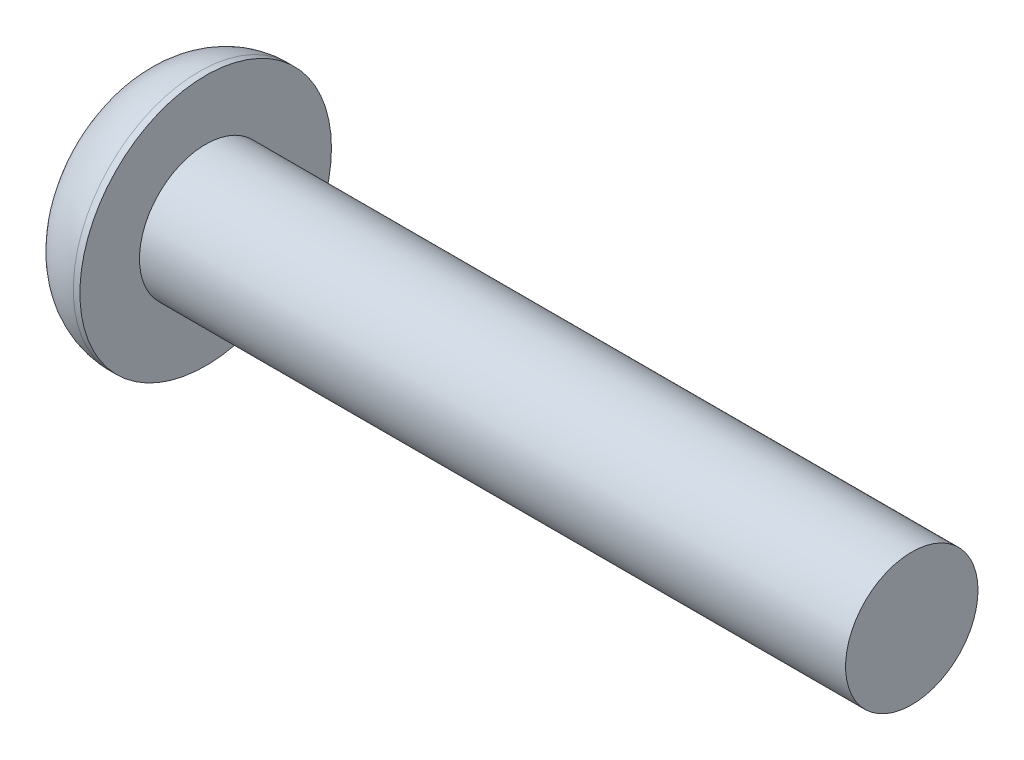
ISO-10303-21;
HEADER;
FILE_DESCRIPTION(('STEP AP214'),'2;1');
FILE_NAME('part.step','',(''),(''),'','','');
FILE_SCHEMA(('AUTOMOTIVE_DESIGN { 1 0 10303 214 1 1 1 1 }'));
ENDSEC;
DATA;
#1=APPLICATION_CONTEXT('core data for automotive mechanical design processes');
#2=APPLICATION_PROTOCOL_DEFINITION('international standard','automotive_design',2000,#1);
#3=PRODUCT_CONTEXT('',#1,'mechanical');
#4=PRODUCT('Part','Part','',(#3));
#5=PRODUCT_RELATED_PRODUCT_CATEGORY('part','',(#4));
#6=PRODUCT_DEFINITION_FORMATION('','',#4);
#7=PRODUCT_DEFINITION_CONTEXT('part definition',#1,'design');
#8=PRODUCT_DEFINITION('design','',#6,#7);
#9=PRODUCT_DEFINITION_SHAPE('','',#8);
#10=(LENGTH_UNIT() NAMED_UNIT(*) SI_UNIT(.MILLI.,.METRE.));
#11=(NAMED_UNIT(*) PLANE_ANGLE_UNIT() SI_UNIT($,.RADIAN.));
#12=(NAMED_UNIT(*) SI_UNIT($,.STERADIAN.) SOLID_ANGLE_UNIT());
#13=UNCERTAINTY_MEASURE_WITH_UNIT(LENGTH_MEASURE(1.E-05),#10,'distance_accuracy_value','');
#14=(GEOMETRIC_REPRESENTATION_CONTEXT(3) GLOBAL_UNCERTAINTY_ASSIGNED_CONTEXT((#13)) GLOBAL_UNIT_ASSIGNED_CONTEXT((#10,
#11,#12)) REPRESENTATION_CONTEXT('',''));
#15=CARTESIAN_POINT('',(0.,0.,0.));
#16=DIRECTION('',(0.,0.,1.));
#17=DIRECTION('',(1.,0.,0.));
#18=AXIS2_PLACEMENT_3D('',#15,#16,#17);
#19=CARTESIAN_POINT('',(0.,0.,-1.34999999999999));
#20=DIRECTION('',(-1.,0.,0.));
#21=DIRECTION('',(0.,0.,1.));
#22=AXIS2_PLACEMENT_3D('',#19,#20,#21);
#23=PLANE('',#22);
#24=DIRECTION('',(0.,0.866025403784439,0.5));
#25=VECTOR('',#24,1.);
#26=CARTESIAN_POINT('',(0.,-1.,0.577350269189626));
#27=LINE('',#26,#25);
#28=CARTESIAN_POINT('',(0.,-1.,0.577350269189626));
#29=VERTEX_POINT('',#28);
#30=CARTESIAN_POINT('',(0.,0.,1.15470053837925));
#31=VERTEX_POINT('',#30);
#32=EDGE_CURVE('E46',#29,#31,#27,.T.);
#33=ORIENTED_EDGE('',*,*,#32,.F.);
#34=DIRECTION('',(0.,0.,1.));
#35=VECTOR('',#34,1.);
#36=CARTESIAN_POINT('',(0.,-1.,-0.577350269189626));
#37=LINE('',#36,#35);
#38=CARTESIAN_POINT('',(0.,-1.,-0.577350269189626));
#39=VERTEX_POINT('',#38);
#40=EDGE_CURVE('E129',#39,#29,#37,.T.);
#41=ORIENTED_EDGE('',*,*,#40,.F.);
#42=DIRECTION('',(0.,-0.866025403784439,0.5));
#43=VECTOR('',#42,1.);
#44=CARTESIAN_POINT('',(0.,0.,-1.15470053837925));
#45=LINE('',#44,#43);
#46=CARTESIAN_POINT('',(0.,0.,-1.15470053837925));
#47=VERTEX_POINT('',#46);
#48=EDGE_CURVE('E127',#47,#39,#45,.T.);
#49=ORIENTED_EDGE('',*,*,#48,.F.);
#50=DIRECTION('',(0.,-0.866025403784439,-0.5));
#51=VECTOR('',#50,1.);
#52=CARTESIAN_POINT('',(0.,1.,-0.577350269189626));
#53=LINE('',#52,#51);
#54=CARTESIAN_POINT('',(0.,1.,-0.577350269189626));
#55=VERTEX_POINT('',#54);
#56=EDGE_CURVE('E94',#55,#47,#53,.T.);
#57=ORIENTED_EDGE('',*,*,#56,.F.);
#58=DIRECTION('',(0.,0.,-1.));
#59=VECTOR('',#58,1.);
#60=CARTESIAN_POINT('',(0.,1.,0.577350269189625));
#61=LINE('',#60,#59);
#62=CARTESIAN_POINT('',(0.,1.,0.577350269189625));
#63=VERTEX_POINT('',#62);
#64=EDGE_CURVE('E123',#63,#55,#61,.T.);
#65=ORIENTED_EDGE('',*,*,#64,.F.);
#66=DIRECTION('',(0.,0.866025403784439,-0.5));
#67=VECTOR('',#66,1.);
#68=CARTESIAN_POINT('',(0.,0.,1.15470053837925));
#69=LINE('',#68,#67);
#70=EDGE_CURVE('E120',#31,#63,#69,.T.);
#71=ORIENTED_EDGE('',*,*,#70,.F.);
#72=EDGE_LOOP('',(#33,#41,#49,#57,#65,#71));
#73=FACE_BOUND('',#72,.T.);
#74=CARTESIAN_POINT('',(0.,0.,0.));
#75=DIRECTION('',(1.,0.,0.));
#76=DIRECTION('',(0.,0.,-1.));
#77=AXIS2_PLACEMENT_3D('',#74,#75,#76);
#78=CIRCLE('',#77,1.34999999999999);
#79=CARTESIAN_POINT('',(0.,0.,-1.34999999999999));
#80=VERTEX_POINT('',#79);
#81=EDGE_CURVE('E11',#80,#80,#78,.T.);
#82=ORIENTED_EDGE('',*,*,#81,.F.);
#83=EDGE_LOOP('',(#82));
#84=FACE_BOUND('',#83,.T.);
#85=ADVANCED_FACE('F32',(#73,#84),#23,.T.);
#86=CARTESIAN_POINT('',(1.5,0.,0.));
#87=DIRECTION('',(1.,0.,0.));
#88=DIRECTION('',(0.,0.,-1.));
#89=AXIS2_PLACEMENT_3D('',#86,#87,#88);
#90=DEGENERATE_TOROIDAL_SURFACE('',#89,1.35,1.5,.T.);
#91=ORIENTED_EDGE('',*,*,#81,.T.);
#92=EDGE_LOOP('',(#91));
#93=FACE_BOUND('',#92,.T.);
#94=CARTESIAN_POINT('',(1.50000000000001,0.,0.));
#95=DIRECTION('',(1.,0.,0.));
#96=DIRECTION('',(0.,0.,-1.));
#97=AXIS2_PLACEMENT_3D('',#94,#95,#96);
#98=CIRCLE('',#97,2.85);
#99=CARTESIAN_POINT('',(1.50000000000001,0.,-2.85));
#100=VERTEX_POINT('',#99);
#101=EDGE_CURVE('E39',#100,#100,#98,.T.);
#102=ORIENTED_EDGE('',*,*,#101,.F.);
#103=EDGE_LOOP('',(#102));
#104=FACE_BOUND('',#103,.T.);
#105=ADVANCED_FACE('F152',(#93,#104),#90,.T.);
#106=CARTESIAN_POINT('',(0.,0.,0.));
#107=DIRECTION('',(1.,0.,0.));
#108=DIRECTION('',(0.,0.,-1.));
#109=AXIS2_PLACEMENT_3D('',#106,#107,#108);
#110=CYLINDRICAL_SURFACE('',#109,2.85);
#111=ORIENTED_EDGE('',*,*,#101,.T.);
#112=EDGE_LOOP('',(#111));
#113=FACE_BOUND('',#112,.T.);
#114=CARTESIAN_POINT('',(1.65,0.,0.));
#115=DIRECTION('',(1.,0.,0.));
#116=DIRECTION('',(0.,0.,-1.));
#117=AXIS2_PLACEMENT_3D('',#114,#115,#116);
#118=CIRCLE('',#117,2.85);
#119=CARTESIAN_POINT('',(1.65,0.,-2.85));
#120=VERTEX_POINT('',#119);
#121=EDGE_CURVE('E144',#120,#120,#118,.T.);
#122=ORIENTED_EDGE('',*,*,#121,.F.);
#123=EDGE_LOOP('',(#122));
#124=FACE_BOUND('',#123,.T.);
#125=ADVANCED_FACE('F149',(#113,#124),#110,.T.);
#126=CARTESIAN_POINT('',(1.65,0.,-1.5));
#127=DIRECTION('',(1.,0.,0.));
#128=DIRECTION('',(0.,0.,-1.));
#129=AXIS2_PLACEMENT_3D('',#126,#127,#128);
#130=PLANE('',#129);
#131=ORIENTED_EDGE('',*,*,#121,.T.);
#132=EDGE_LOOP('',(#131));
#133=FACE_BOUND('',#132,.T.);
#134=CARTESIAN_POINT('',(1.65,0.,0.));
#135=DIRECTION('',(1.,0.,0.));
#136=DIRECTION('',(0.,0.,-1.));
#137=AXIS2_PLACEMENT_3D('',#134,#135,#136);
#138=CIRCLE('',#137,1.5);
#139=CARTESIAN_POINT('',(1.65,0.,-1.5));
#140=VERTEX_POINT('',#139);
#141=EDGE_CURVE('E141',#140,#140,#138,.T.);
#142=ORIENTED_EDGE('',*,*,#141,.F.);
#143=EDGE_LOOP('',(#142));
#144=FACE_BOUND('',#143,.T.);
#145=ADVANCED_FACE('F159',(#133,#144),#130,.T.);
#146=CARTESIAN_POINT('',(0.,0.,0.));
#147=DIRECTION('',(1.,0.,0.));
#148=DIRECTION('',(0.,0.,-1.));
#149=AXIS2_PLACEMENT_3D('',#146,#147,#148);
#150=CYLINDRICAL_SURFACE('',#149,1.5);
#151=ORIENTED_EDGE('',*,*,#141,.T.);
#152=EDGE_LOOP('',(#151));
#153=FACE_BOUND('',#152,.T.);
#154=CARTESIAN_POINT('',(17.65,0.,0.));
#155=DIRECTION('',(1.,0.,0.));
#156=DIRECTION('',(0.,0.,-1.));
#157=AXIS2_PLACEMENT_3D('',#154,#155,#156);
#158=CIRCLE('',#157,1.5);
#159=CARTESIAN_POINT('',(17.65,0.,-1.5));
#160=VERTEX_POINT('',#159);
#161=EDGE_CURVE('E133',#160,#160,#158,.T.);
#162=ORIENTED_EDGE('',*,*,#161,.F.);
#163=EDGE_LOOP('',(#162));
#164=FACE_BOUND('',#163,.T.);
#165=ADVANCED_FACE('F165',(#153,#164),#150,.T.);
#166=CARTESIAN_POINT('',(17.65,0.,0.));
#167=DIRECTION('',(1.,0.,0.));
#168=DIRECTION('',(0.,0.,-1.));
#169=AXIS2_PLACEMENT_3D('',#166,#167,#168);
#170=PLANE('',#169);
#171=ORIENTED_EDGE('',*,*,#161,.T.);
#172=EDGE_LOOP('',(#171));
#173=FACE_BOUND('',#172,.T.);
#174=ADVANCED_FACE('F169',(#173),#170,.T.);
#175=CARTESIAN_POINT('',(1.04,-1.,0.577350269189626));
#176=DIRECTION('',(0.,-0.5,0.866025403784439));
#177=DIRECTION('',(0.,-0.866025403784439,-0.5));
#178=AXIS2_PLACEMENT_3D('',#175,#176,#177);
#179=PLANE('',#178);
#180=ORIENTED_EDGE('',*,*,#32,.T.);
#181=DIRECTION('',(-1.,0.,0.));
#182=VECTOR('',#181,1.);
#183=CARTESIAN_POINT('',(1.04,0.,1.15470053837925));
#184=LINE('',#183,#182);
#185=CARTESIAN_POINT('',(1.04,0.,1.15470053837925));
#186=VERTEX_POINT('',#185);
#187=EDGE_CURVE('E76',#186,#31,#184,.T.);
#188=ORIENTED_EDGE('',*,*,#187,.F.);
#189=DIRECTION('',(0.,0.866025403784439,0.5));
#190=VECTOR('',#189,1.);
#191=CARTESIAN_POINT('',(1.04,-1.,0.577350269189626));
#192=LINE('',#191,#190);
#193=CARTESIAN_POINT('',(1.04,-1.,0.577350269189626));
#194=VERTEX_POINT('',#193);
#195=EDGE_CURVE('E131',#194,#186,#192,.T.);
#196=ORIENTED_EDGE('',*,*,#195,.F.);
#197=DIRECTION('',(-1.,0.,0.));
#198=VECTOR('',#197,1.);
#199=CARTESIAN_POINT('',(1.04,-1.,0.577350269189626));
#200=LINE('',#199,#198);
#201=EDGE_CURVE('E54',#194,#29,#200,.T.);
#202=ORIENTED_EDGE('',*,*,#201,.T.);
#203=EDGE_LOOP('',(#180,#188,#196,#202));
#204=FACE_BOUND('',#203,.T.);
#205=ADVANCED_FACE('F173',(#204),#179,.F.);
#206=CARTESIAN_POINT('',(1.04,-1.,-0.577350269189626));
#207=DIRECTION('',(0.,-1.,0.));
#208=DIRECTION('',(0.,0.,-1.));
#209=AXIS2_PLACEMENT_3D('',#206,#207,#208);
#210=PLANE('',#209);
#211=ORIENTED_EDGE('',*,*,#40,.T.);
#212=ORIENTED_EDGE('',*,*,#201,.F.);
#213=DIRECTION('',(0.,0.,1.));
#214=VECTOR('',#213,1.);
#215=CARTESIAN_POINT('',(1.04,-1.,-0.577350269189626));
#216=LINE('',#215,#214);
#217=CARTESIAN_POINT('',(1.04,-1.,-0.577350269189626));
#218=VERTEX_POINT('',#217);
#219=EDGE_CURVE('E106',#218,#194,#216,.T.);
#220=ORIENTED_EDGE('',*,*,#219,.F.);
#221=DIRECTION('',(-1.,0.,0.));
#222=VECTOR('',#221,1.);
#223=CARTESIAN_POINT('',(1.04,-1.,-0.577350269189626));
#224=LINE('',#223,#222);
#225=EDGE_CURVE('E98',#218,#39,#224,.T.);
#226=ORIENTED_EDGE('',*,*,#225,.T.);
#227=EDGE_LOOP('',(#211,#212,#220,#226));
#228=FACE_BOUND('',#227,.T.);
#229=ADVANCED_FACE('F177',(#228),#210,.F.);
#230=CARTESIAN_POINT('',(1.04,0.,-1.15470053837925));
#231=DIRECTION('',(0.,-0.5,-0.866025403784439));
#232=DIRECTION('',(0.,0.866025403784439,-0.5));
#233=AXIS2_PLACEMENT_3D('',#230,#231,#232);
#234=PLANE('',#233);
#235=ORIENTED_EDGE('',*,*,#48,.T.);
#236=ORIENTED_EDGE('',*,*,#225,.F.);
#237=DIRECTION('',(0.,-0.866025403784439,0.5));
#238=VECTOR('',#237,1.);
#239=CARTESIAN_POINT('',(1.04,0.,-1.15470053837925));
#240=LINE('',#239,#238);
#241=CARTESIAN_POINT('',(1.04,0.,-1.15470053837925));
#242=VERTEX_POINT('',#241);
#243=EDGE_CURVE('E102',#242,#218,#240,.T.);
#244=ORIENTED_EDGE('',*,*,#243,.F.);
#245=DIRECTION('',(-1.,0.,0.));
#246=VECTOR('',#245,1.);
#247=CARTESIAN_POINT('',(1.04,0.,-1.15470053837925));
#248=LINE('',#247,#246);
#249=EDGE_CURVE('E87',#242,#47,#248,.T.);
#250=ORIENTED_EDGE('',*,*,#249,.T.);
#251=EDGE_LOOP('',(#235,#236,#244,#250));
#252=FACE_BOUND('',#251,.T.);
#253=ADVANCED_FACE('F103',(#252),#234,.F.);
#254=CARTESIAN_POINT('',(1.04,1.,-0.577350269189626));
#255=DIRECTION('',(0.,0.5,-0.866025403784439));
#256=DIRECTION('',(0.,0.866025403784439,0.5));
#257=AXIS2_PLACEMENT_3D('',#254,#255,#256);
#258=PLANE('',#257);
#259=ORIENTED_EDGE('',*,*,#56,.T.);
#260=ORIENTED_EDGE('',*,*,#249,.F.);
#261=DIRECTION('',(0.,-0.866025403784439,-0.5));
#262=VECTOR('',#261,1.);
#263=CARTESIAN_POINT('',(1.04,1.,-0.577350269189626));
#264=LINE('',#263,#262);
#265=CARTESIAN_POINT('',(1.04,1.,-0.577350269189626));
#266=VERTEX_POINT('',#265);
#267=EDGE_CURVE('E91',#266,#242,#264,.T.);
#268=ORIENTED_EDGE('',*,*,#267,.F.);
#269=DIRECTION('',(-1.,0.,0.));
#270=VECTOR('',#269,1.);
#271=CARTESIAN_POINT('',(1.04,1.,-0.577350269189626));
#272=LINE('',#271,#270);
#273=EDGE_CURVE('E99',#266,#55,#272,.T.);
#274=ORIENTED_EDGE('',*,*,#273,.T.);
#275=EDGE_LOOP('',(#259,#260,#268,#274));
#276=FACE_BOUND('',#275,.T.);
#277=ADVANCED_FACE('F89',(#276),#258,.F.);
#278=CARTESIAN_POINT('',(1.04,1.,0.577350269189625));
#279=DIRECTION('',(0.,1.,0.));
#280=DIRECTION('',(0.,0.,1.));
#281=AXIS2_PLACEMENT_3D('',#278,#279,#280);
#282=PLANE('',#281);
#283=ORIENTED_EDGE('',*,*,#64,.T.);
#284=ORIENTED_EDGE('',*,*,#273,.F.);
#285=DIRECTION('',(0.,0.,-1.));
#286=VECTOR('',#285,1.);
#287=CARTESIAN_POINT('',(1.04,1.,0.577350269189625));
#288=LINE('',#287,#286);
#289=CARTESIAN_POINT('',(1.04,1.,0.577350269189625));
#290=VERTEX_POINT('',#289);
#291=EDGE_CURVE('E112',#290,#266,#288,.T.);
#292=ORIENTED_EDGE('',*,*,#291,.F.);
#293=DIRECTION('',(-1.,0.,0.));
#294=VECTOR('',#293,1.);
#295=CARTESIAN_POINT('',(1.04,1.,0.577350269189625));
#296=LINE('',#295,#294);
#297=EDGE_CURVE('E136',#290,#63,#296,.T.);
#298=ORIENTED_EDGE('',*,*,#297,.T.);
#299=EDGE_LOOP('',(#283,#284,#292,#298));
#300=FACE_BOUND('',#299,.T.);
#301=ADVANCED_FACE('F181',(#300),#282,.F.);
#302=CARTESIAN_POINT('',(1.04,0.,1.15470053837925));
#303=DIRECTION('',(0.,0.5,0.866025403784439));
#304=DIRECTION('',(0.,-0.866025403784439,0.5));
#305=AXIS2_PLACEMENT_3D('',#302,#303,#304);
#306=PLANE('',#305);
#307=ORIENTED_EDGE('',*,*,#70,.T.);
#308=ORIENTED_EDGE('',*,*,#297,.F.);
#309=DIRECTION('',(0.,0.866025403784439,-0.5));
#310=VECTOR('',#309,1.);
#311=CARTESIAN_POINT('',(1.04,0.,1.15470053837925));
#312=LINE('',#311,#310);
#313=EDGE_CURVE('E114',#186,#290,#312,.T.);
#314=ORIENTED_EDGE('',*,*,#313,.F.);
#315=ORIENTED_EDGE('',*,*,#187,.T.);
#316=EDGE_LOOP('',(#307,#308,#314,#315));
#317=FACE_BOUND('',#316,.T.);
#318=ADVANCED_FACE('F178',(#317),#306,.F.);
#319=CARTESIAN_POINT('',(1.04,0.,0.));
#320=DIRECTION('',(-1.,0.,0.));
#321=DIRECTION('',(0.,0.,1.));
#322=AXIS2_PLACEMENT_3D('',#319,#320,#321);
#323=PLANE('',#322);
#324=ORIENTED_EDGE('',*,*,#195,.T.);
#325=ORIENTED_EDGE('',*,*,#313,.T.);
#326=ORIENTED_EDGE('',*,*,#291,.T.);
#327=ORIENTED_EDGE('',*,*,#267,.T.);
#328=ORIENTED_EDGE('',*,*,#243,.T.);
#329=ORIENTED_EDGE('',*,*,#219,.T.);
#330=EDGE_LOOP('',(#324,#325,#326,#327,#328,#329));
#331=FACE_BOUND('',#330,.T.);
#332=ADVANCED_FACE('F109',(#331),#323,.T.);
#333=CLOSED_SHELL('',(#85,#105,#125,#145,#165,#174,#205,#229,#253,#277,#301,#318,#332));
#334=MANIFOLD_SOLID_BREP('B2',#333);
#335=ADVANCED_BREP_SHAPE_REPRESENTATION('',(#18,#334),#14);
#336=SHAPE_DEFINITION_REPRESENTATION(#9,#335);
ENDSEC;
END-ISO-10303-21;
